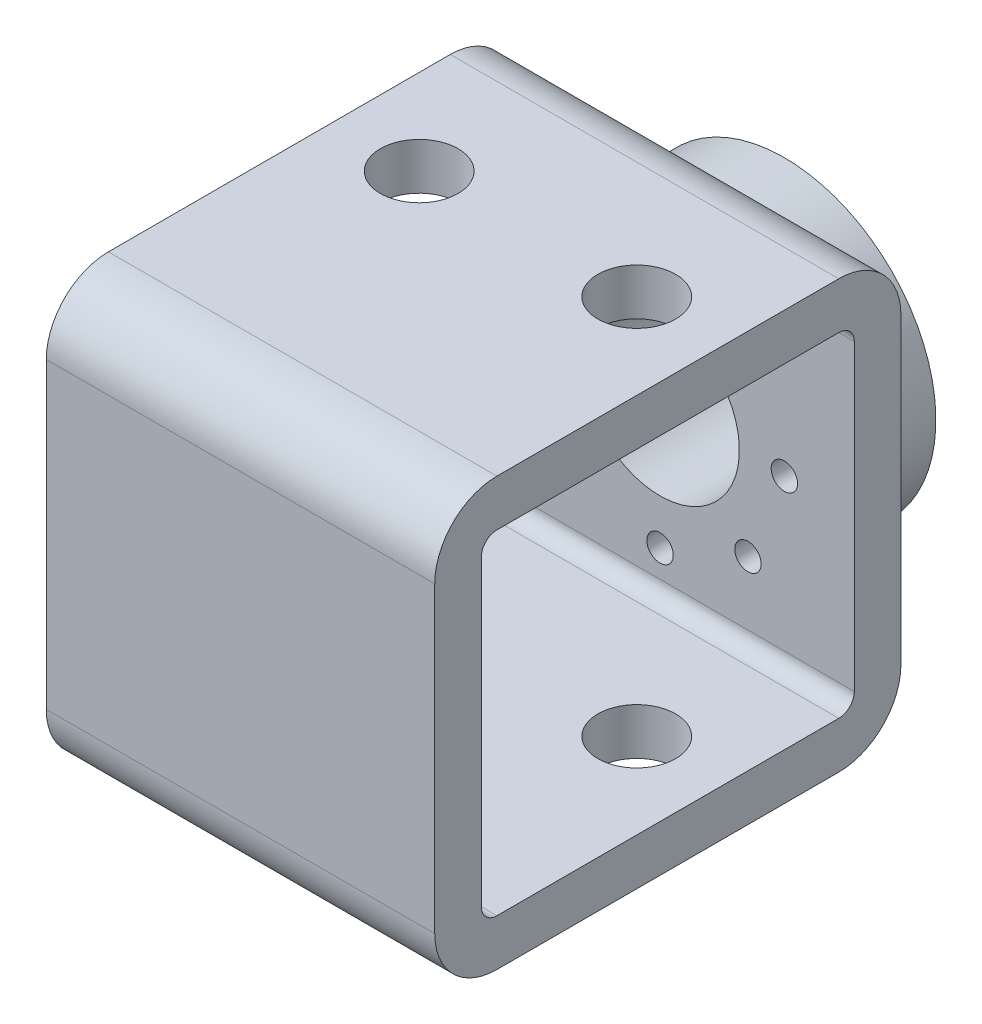
ISO-10303-21;
HEADER;
FILE_DESCRIPTION(('STEP AP214'),'2;1');
FILE_NAME('part.step','',(''),(''),'','','');
FILE_SCHEMA(('AUTOMOTIVE_DESIGN { 1 0 10303 214 1 1 1 1 }'));
ENDSEC;
DATA;
#1=APPLICATION_CONTEXT('core data for automotive mechanical design processes');
#2=APPLICATION_PROTOCOL_DEFINITION('international standard','automotive_design',2000,#1);
#3=PRODUCT_CONTEXT('',#1,'mechanical');
#4=PRODUCT('Part','Part','',(#3));
#5=PRODUCT_RELATED_PRODUCT_CATEGORY('part','',(#4));
#6=PRODUCT_DEFINITION_FORMATION('','',#4);
#7=PRODUCT_DEFINITION_CONTEXT('part definition',#1,'design');
#8=PRODUCT_DEFINITION('design','',#6,#7);
#9=PRODUCT_DEFINITION_SHAPE('','',#8);
#10=(LENGTH_UNIT() NAMED_UNIT(*) SI_UNIT(.MILLI.,.METRE.));
#11=(NAMED_UNIT(*) PLANE_ANGLE_UNIT() SI_UNIT($,.RADIAN.));
#12=(NAMED_UNIT(*) SI_UNIT($,.STERADIAN.) SOLID_ANGLE_UNIT());
#13=UNCERTAINTY_MEASURE_WITH_UNIT(LENGTH_MEASURE(1.E-05),#10,'distance_accuracy_value','');
#14=(GEOMETRIC_REPRESENTATION_CONTEXT(3) GLOBAL_UNCERTAINTY_ASSIGNED_CONTEXT((#13)) GLOBAL_UNIT_ASSIGNED_CONTEXT((#10,
#11,#12)) REPRESENTATION_CONTEXT('',''));
#15=CARTESIAN_POINT('',(0.,0.,0.));
#16=DIRECTION('',(0.,0.,1.));
#17=DIRECTION('',(1.,0.,0.));
#18=AXIS2_PLACEMENT_3D('',#15,#16,#17);
#19=CARTESIAN_POINT('',(0.,0.,0.));
#20=DIRECTION('',(0.,0.,1.));
#21=DIRECTION('',(1.,0.,0.));
#22=AXIS2_PLACEMENT_3D('',#19,#20,#21);
#23=PLANE('',#22);
#24=CARTESIAN_POINT('',(-5.656854249492,5.656854249492,0.));
#25=DIRECTION('',(0.,0.,-1.));
#26=DIRECTION('',(-1.,0.,0.));
#27=AXIS2_PLACEMENT_3D('',#24,#25,#26);
#28=CIRCLE('',#27,0.85);
#29=CARTESIAN_POINT('',(-6.506854249492,5.656854249492,0.));
#30=VERTEX_POINT('',#29);
#31=EDGE_CURVE('E303',#30,#30,#28,.F.);
#32=ORIENTED_EDGE('',*,*,#31,.T.);
#33=EDGE_LOOP('',(#32));
#34=FACE_BOUND('',#33,.T.);
#35=CARTESIAN_POINT('',(-8.,0.,0.));
#36=DIRECTION('',(0.,0.,-1.));
#37=DIRECTION('',(-1.,0.,0.));
#38=AXIS2_PLACEMENT_3D('',#35,#36,#37);
#39=CIRCLE('',#38,0.85);
#40=CARTESIAN_POINT('',(-8.85,0.,0.));
#41=VERTEX_POINT('',#40);
#42=EDGE_CURVE('E324',#41,#41,#39,.F.);
#43=ORIENTED_EDGE('',*,*,#42,.T.);
#44=EDGE_LOOP('',(#43));
#45=FACE_BOUND('',#44,.T.);
#46=CARTESIAN_POINT('',(-5.656854249492,-5.656854249492,0.));
#47=DIRECTION('',(0.,0.,-1.));
#48=DIRECTION('',(-1.,0.,0.));
#49=AXIS2_PLACEMENT_3D('',#46,#47,#48);
#50=CIRCLE('',#49,0.85);
#51=CARTESIAN_POINT('',(-6.506854249492,-5.656854249492,0.));
#52=VERTEX_POINT('',#51);
#53=EDGE_CURVE('E321',#52,#52,#50,.F.);
#54=ORIENTED_EDGE('',*,*,#53,.T.);
#55=EDGE_LOOP('',(#54));
#56=FACE_BOUND('',#55,.T.);
#57=CARTESIAN_POINT('',(0.,-8.,0.));
#58=DIRECTION('',(0.,0.,-1.));
#59=DIRECTION('',(-1.,0.,0.));
#60=AXIS2_PLACEMENT_3D('',#57,#58,#59);
#61=CIRCLE('',#60,0.85);
#62=CARTESIAN_POINT('',(-0.85,-8.,0.));
#63=VERTEX_POINT('',#62);
#64=EDGE_CURVE('E318',#63,#63,#61,.F.);
#65=ORIENTED_EDGE('',*,*,#64,.T.);
#66=EDGE_LOOP('',(#65));
#67=FACE_BOUND('',#66,.T.);
#68=CARTESIAN_POINT('',(5.656854249492,-5.656854249492,0.));
#69=DIRECTION('',(0.,0.,-1.));
#70=DIRECTION('',(-1.,0.,0.));
#71=AXIS2_PLACEMENT_3D('',#68,#69,#70);
#72=CIRCLE('',#71,0.85);
#73=CARTESIAN_POINT('',(4.806854249492,-5.656854249492,0.));
#74=VERTEX_POINT('',#73);
#75=EDGE_CURVE('E315',#74,#74,#72,.F.);
#76=ORIENTED_EDGE('',*,*,#75,.T.);
#77=EDGE_LOOP('',(#76));
#78=FACE_BOUND('',#77,.T.);
#79=CARTESIAN_POINT('',(8.,0.,0.));
#80=DIRECTION('',(0.,0.,-1.));
#81=DIRECTION('',(-1.,0.,0.));
#82=AXIS2_PLACEMENT_3D('',#79,#80,#81);
#83=CIRCLE('',#82,0.85);
#84=CARTESIAN_POINT('',(7.15,0.,0.));
#85=VERTEX_POINT('',#84);
#86=EDGE_CURVE('E312',#85,#85,#83,.F.);
#87=ORIENTED_EDGE('',*,*,#86,.T.);
#88=EDGE_LOOP('',(#87));
#89=FACE_BOUND('',#88,.T.);
#90=CARTESIAN_POINT('',(5.656854249492,5.656854249492,0.));
#91=DIRECTION('',(0.,0.,-1.));
#92=DIRECTION('',(-1.,0.,0.));
#93=AXIS2_PLACEMENT_3D('',#90,#91,#92);
#94=CIRCLE('',#93,0.850000000000001);
#95=CARTESIAN_POINT('',(4.806854249492,5.656854249492,0.));
#96=VERTEX_POINT('',#95);
#97=EDGE_CURVE('E309',#96,#96,#94,.F.);
#98=ORIENTED_EDGE('',*,*,#97,.T.);
#99=EDGE_LOOP('',(#98));
#100=FACE_BOUND('',#99,.T.);
#101=CARTESIAN_POINT('',(0.,8.,0.));
#102=DIRECTION('',(0.,0.,-1.));
#103=DIRECTION('',(-1.,0.,0.));
#104=AXIS2_PLACEMENT_3D('',#101,#102,#103);
#105=CIRCLE('',#104,0.85);
#106=CARTESIAN_POINT('',(-0.85,8.,0.));
#107=VERTEX_POINT('',#106);
#108=EDGE_CURVE('E306',#107,#107,#105,.F.);
#109=ORIENTED_EDGE('',*,*,#108,.T.);
#110=EDGE_LOOP('',(#109));
#111=FACE_BOUND('',#110,.T.);
#112=CARTESIAN_POINT('',(0.,0.,0.));
#113=DIRECTION('',(0.,0.,-1.));
#114=DIRECTION('',(-1.,0.,0.));
#115=AXIS2_PLACEMENT_3D('',#112,#113,#114);
#116=CIRCLE('',#115,5.10415336334852);
#117=CARTESIAN_POINT('',(-5.10415336334852,0.,0.));
#118=VERTEX_POINT('',#117);
#119=EDGE_CURVE('E300',#118,#118,#116,.F.);
#120=ORIENTED_EDGE('',*,*,#119,.T.);
#121=EDGE_LOOP('',(#120));
#122=FACE_BOUND('',#121,.T.);
#123=CARTESIAN_POINT('',(0.,0.,0.));
#124=DIRECTION('',(0.,0.,-1.));
#125=DIRECTION('',(-1.,0.,0.));
#126=AXIS2_PLACEMENT_3D('',#123,#124,#125);
#127=CIRCLE('',#126,9.75);
#128=CARTESIAN_POINT('',(-9.75,0.,0.));
#129=VERTEX_POINT('',#128);
#130=EDGE_CURVE('E20',#129,#129,#127,.F.);
#131=ORIENTED_EDGE('',*,*,#130,.F.);
#132=EDGE_LOOP('',(#131));
#133=FACE_BOUND('',#132,.T.);
#134=ADVANCED_FACE('F17',(#34,#45,#56,#67,#78,#89,#100,#111,#122,#133),#23,.F.);
#135=CARTESIAN_POINT('',(0.,0.,35.5771644662753));
#136=DIRECTION('',(0.,0.,-1.));
#137=DIRECTION('',(-1.,0.,0.));
#138=AXIS2_PLACEMENT_3D('',#135,#136,#137);
#139=CYLINDRICAL_SURFACE('',#138,9.75);
#140=ORIENTED_EDGE('',*,*,#130,.T.);
#141=EDGE_LOOP('',(#140));
#142=FACE_BOUND('',#141,.T.);
#143=CARTESIAN_POINT('',(0.,0.,4.99999999999991));
#144=DIRECTION('',(0.,0.,-1.));
#145=DIRECTION('',(-1.,0.,0.));
#146=AXIS2_PLACEMENT_3D('',#143,#144,#145);
#147=CIRCLE('',#146,9.75);
#148=CARTESIAN_POINT('',(0.,-9.75,4.99999999999995));
#149=VERTEX_POINT('',#148);
#150=CARTESIAN_POINT('',(0.,9.75,4.99999999999995));
#151=VERTEX_POINT('',#150);
#152=EDGE_CURVE('E213',#149,#151,#147,.T.);
#153=ORIENTED_EDGE('',*,*,#152,.T.);
#154=CARTESIAN_POINT('',(0.,0.,4.99999999999992));
#155=DIRECTION('',(0.,0.,-1.));
#156=DIRECTION('',(-1.,0.,0.));
#157=AXIS2_PLACEMENT_3D('',#154,#155,#156);
#158=CIRCLE('',#157,9.75);
#159=EDGE_CURVE('E289',#151,#149,#158,.T.);
#160=ORIENTED_EDGE('',*,*,#159,.T.);
#161=EDGE_LOOP('',(#153,#160));
#162=FACE_BOUND('',#161,.T.);
#163=ADVANCED_FACE('F494',(#142,#162),#139,.T.);
#164=CARTESIAN_POINT('',(7.,13.75,16.4999999999999));
#165=DIRECTION('',(0.,-1.,0.));
#166=DIRECTION('',(0.,0.,-1.));
#167=AXIS2_PLACEMENT_3D('',#164,#165,#166);
#168=CYLINDRICAL_SURFACE('',#167,2.49999999999997);
#169=CARTESIAN_POINT('',(7.,10.75,16.4999999999999));
#170=DIRECTION('',(0.,-1.,0.));
#171=DIRECTION('',(0.,0.,-1.));
#172=AXIS2_PLACEMENT_3D('',#169,#170,#171);
#173=CIRCLE('',#172,2.49999999999997);
#174=CARTESIAN_POINT('',(7.,10.75,13.9999999999999));
#175=VERTEX_POINT('',#174);
#176=EDGE_CURVE('E201',#175,#175,#173,.F.);
#177=ORIENTED_EDGE('',*,*,#176,.F.);
#178=EDGE_LOOP('',(#177));
#179=FACE_BOUND('',#178,.T.);
#180=CARTESIAN_POINT('',(7.,13.75,16.4999999999999));
#181=DIRECTION('',(0.,-1.,0.));
#182=DIRECTION('',(0.,0.,-1.));
#183=AXIS2_PLACEMENT_3D('',#180,#181,#182);
#184=CIRCLE('',#183,2.49999999999997);
#185=CARTESIAN_POINT('',(7.,13.75,13.9999999999999));
#186=VERTEX_POINT('',#185);
#187=EDGE_CURVE('E286',#186,#186,#184,.F.);
#188=ORIENTED_EDGE('',*,*,#187,.T.);
#189=EDGE_LOOP('',(#188));
#190=FACE_BOUND('',#189,.T.);
#191=ADVANCED_FACE('F513',(#179,#190),#168,.F.);
#192=CARTESIAN_POINT('',(-7.,13.75,16.4999999999999));
#193=DIRECTION('',(0.,-1.,0.));
#194=DIRECTION('',(0.,0.,-1.));
#195=AXIS2_PLACEMENT_3D('',#192,#193,#194);
#196=CYLINDRICAL_SURFACE('',#195,2.49999999999997);
#197=CARTESIAN_POINT('',(-7.,10.75,16.4999999999999));
#198=DIRECTION('',(0.,-1.,0.));
#199=DIRECTION('',(0.,0.,-1.));
#200=AXIS2_PLACEMENT_3D('',#197,#198,#199);
#201=CIRCLE('',#200,2.49999999999997);
#202=CARTESIAN_POINT('',(-7.,10.75,13.9999999999999));
#203=VERTEX_POINT('',#202);
#204=EDGE_CURVE('E197',#203,#203,#201,.F.);
#205=ORIENTED_EDGE('',*,*,#204,.F.);
#206=EDGE_LOOP('',(#205));
#207=FACE_BOUND('',#206,.T.);
#208=CARTESIAN_POINT('',(-7.,13.75,16.4999999999999));
#209=DIRECTION('',(0.,-1.,0.));
#210=DIRECTION('',(0.,0.,-1.));
#211=AXIS2_PLACEMENT_3D('',#208,#209,#210);
#212=CIRCLE('',#211,2.49999999999997);
#213=CARTESIAN_POINT('',(-7.,13.75,13.9999999999999));
#214=VERTEX_POINT('',#213);
#215=EDGE_CURVE('E220',#214,#214,#212,.F.);
#216=ORIENTED_EDGE('',*,*,#215,.T.);
#217=EDGE_LOOP('',(#216));
#218=FACE_BOUND('',#217,.T.);
#219=ADVANCED_FACE('F389',(#207,#218),#196,.F.);
#220=CARTESIAN_POINT('',(12.5,9.75,31.));
#221=DIRECTION('',(-1.,0.,0.));
#222=DIRECTION('',(0.,0.,1.));
#223=AXIS2_PLACEMENT_3D('',#220,#221,#222);
#224=CYLINDRICAL_SURFACE('',#223,0.999999999999994);
#225=DIRECTION('',(1.,0.,0.));
#226=VECTOR('',#225,1.);
#227=CARTESIAN_POINT('',(12.5,10.75,31.));
#228=LINE('',#227,#226);
#229=CARTESIAN_POINT('',(12.5,10.75,31.));
#230=VERTEX_POINT('',#229);
#231=CARTESIAN_POINT('',(-12.5,10.75,31.));
#232=VERTEX_POINT('',#231);
#233=EDGE_CURVE('E136',#230,#232,#228,.F.);
#234=ORIENTED_EDGE('',*,*,#233,.F.);
#235=CARTESIAN_POINT('',(12.5,9.75,31.));
#236=DIRECTION('',(-1.,0.,0.));
#237=DIRECTION('',(0.,0.,1.));
#238=AXIS2_PLACEMENT_3D('',#235,#236,#237);
#239=CIRCLE('',#238,0.999999999999994);
#240=CARTESIAN_POINT('',(12.5,9.75,32.));
#241=VERTEX_POINT('',#240);
#242=EDGE_CURVE('E130',#241,#230,#239,.T.);
#243=ORIENTED_EDGE('',*,*,#242,.F.);
#244=DIRECTION('',(-1.,0.,0.));
#245=VECTOR('',#244,1.);
#246=CARTESIAN_POINT('',(12.5,9.75,32.));
#247=LINE('',#246,#245);
#248=CARTESIAN_POINT('',(-12.5,9.75,32.));
#249=VERTEX_POINT('',#248);
#250=EDGE_CURVE('E133',#249,#241,#247,.F.);
#251=ORIENTED_EDGE('',*,*,#250,.F.);
#252=CARTESIAN_POINT('',(-12.5,9.75,31.));
#253=DIRECTION('',(-1.,0.,0.));
#254=DIRECTION('',(0.,0.,1.));
#255=AXIS2_PLACEMENT_3D('',#252,#253,#254);
#256=CIRCLE('',#255,0.999999999999994);
#257=EDGE_CURVE('E141',#232,#249,#256,.F.);
#258=ORIENTED_EDGE('',*,*,#257,.F.);
#259=EDGE_LOOP('',(#234,#243,#251,#258));
#260=FACE_BOUND('',#259,.T.);
#261=ADVANCED_FACE('F132',(#260),#224,.F.);
#262=CARTESIAN_POINT('',(12.5,-9.75000000000002,31.));
#263=DIRECTION('',(-1.,0.,0.));
#264=DIRECTION('',(0.,0.,1.));
#265=AXIS2_PLACEMENT_3D('',#262,#263,#264);
#266=CYLINDRICAL_SURFACE('',#265,1.);
#267=DIRECTION('',(-1.,0.,0.));
#268=VECTOR('',#267,1.);
#269=CARTESIAN_POINT('',(12.5,-9.75000000000002,32.));
#270=LINE('',#269,#268);
#271=CARTESIAN_POINT('',(12.5,-9.75000000000002,32.));
#272=VERTEX_POINT('',#271);
#273=CARTESIAN_POINT('',(-12.5,-9.75000000000002,32.));
#274=VERTEX_POINT('',#273);
#275=EDGE_CURVE('E149',#272,#274,#270,.T.);
#276=ORIENTED_EDGE('',*,*,#275,.F.);
#277=CARTESIAN_POINT('',(12.5,-9.75000000000002,31.));
#278=DIRECTION('',(-1.,0.,0.));
#279=DIRECTION('',(0.,0.,1.));
#280=AXIS2_PLACEMENT_3D('',#277,#278,#279);
#281=CIRCLE('',#280,1.);
#282=CARTESIAN_POINT('',(12.5,-10.75,31.));
#283=VERTEX_POINT('',#282);
#284=EDGE_CURVE('E154',#283,#272,#281,.T.);
#285=ORIENTED_EDGE('',*,*,#284,.F.);
#286=DIRECTION('',(1.,0.,0.));
#287=VECTOR('',#286,1.);
#288=CARTESIAN_POINT('',(12.5,-10.75,31.));
#289=LINE('',#288,#287);
#290=CARTESIAN_POINT('',(-12.5,-10.75,31.));
#291=VERTEX_POINT('',#290);
#292=EDGE_CURVE('E186',#291,#283,#289,.T.);
#293=ORIENTED_EDGE('',*,*,#292,.F.);
#294=CARTESIAN_POINT('',(-12.5,-9.75000000000002,31.));
#295=DIRECTION('',(-1.,0.,0.));
#296=DIRECTION('',(0.,0.,1.));
#297=AXIS2_PLACEMENT_3D('',#294,#295,#296);
#298=CIRCLE('',#297,1.);
#299=EDGE_CURVE('E327',#274,#291,#298,.F.);
#300=ORIENTED_EDGE('',*,*,#299,.F.);
#301=EDGE_LOOP('',(#276,#285,#293,#300));
#302=FACE_BOUND('',#301,.T.);
#303=ADVANCED_FACE('F377',(#302),#266,.F.);
#304=CARTESIAN_POINT('',(-8.,0.,35.5771644662753));
#305=DIRECTION('',(0.,0.,-1.));
#306=DIRECTION('',(-1.,0.,0.));
#307=AXIS2_PLACEMENT_3D('',#304,#305,#306);
#308=CYLINDRICAL_SURFACE('',#307,0.85);
#309=CARTESIAN_POINT('',(-8.,0.,7.99999999999999));
#310=DIRECTION('',(0.,0.,-1.));
#311=DIRECTION('',(-1.,0.,0.));
#312=AXIS2_PLACEMENT_3D('',#309,#310,#311);
#313=CIRCLE('',#312,0.85);
#314=CARTESIAN_POINT('',(-8.85,0.,7.99999999999999));
#315=VERTEX_POINT('',#314);
#316=EDGE_CURVE('E191',#315,#315,#313,.T.);
#317=ORIENTED_EDGE('',*,*,#316,.F.);
#318=EDGE_LOOP('',(#317));
#319=FACE_BOUND('',#318,.T.);
#320=ORIENTED_EDGE('',*,*,#42,.F.);
#321=EDGE_LOOP('',(#320));
#322=FACE_BOUND('',#321,.T.);
#323=ADVANCED_FACE('F379',(#319,#322),#308,.F.);
#324=CARTESIAN_POINT('',(-5.656854249492,-5.656854249492,35.5771644662753));
#325=DIRECTION('',(0.,0.,-1.));
#326=DIRECTION('',(-1.,0.,0.));
#327=AXIS2_PLACEMENT_3D('',#324,#325,#326);
#328=CYLINDRICAL_SURFACE('',#327,0.85);
#329=CARTESIAN_POINT('',(-5.656854249492,-5.656854249492,7.99999999999998));
#330=DIRECTION('',(0.,0.,-1.));
#331=DIRECTION('',(-1.,0.,0.));
#332=AXIS2_PLACEMENT_3D('',#329,#330,#331);
#333=CIRCLE('',#332,0.85);
#334=CARTESIAN_POINT('',(-6.506854249492,-5.656854249492,7.99999999999998));
#335=VERTEX_POINT('',#334);
#336=EDGE_CURVE('E273',#335,#335,#333,.T.);
#337=ORIENTED_EDGE('',*,*,#336,.F.);
#338=EDGE_LOOP('',(#337));
#339=FACE_BOUND('',#338,.T.);
#340=ORIENTED_EDGE('',*,*,#53,.F.);
#341=EDGE_LOOP('',(#340));
#342=FACE_BOUND('',#341,.T.);
#343=ADVANCED_FACE('F386',(#339,#342),#328,.F.);
#344=CARTESIAN_POINT('',(0.,-8.,35.5771644662753));
#345=DIRECTION('',(0.,0.,-1.));
#346=DIRECTION('',(-1.,0.,0.));
#347=AXIS2_PLACEMENT_3D('',#344,#345,#346);
#348=CYLINDRICAL_SURFACE('',#347,0.85);
#349=CARTESIAN_POINT('',(0.,-8.,7.99999999999998));
#350=DIRECTION('',(0.,0.,-1.));
#351=DIRECTION('',(-1.,0.,0.));
#352=AXIS2_PLACEMENT_3D('',#349,#350,#351);
#353=CIRCLE('',#352,0.85);
#354=CARTESIAN_POINT('',(-0.85,-8.,7.99999999999998));
#355=VERTEX_POINT('',#354);
#356=EDGE_CURVE('E270',#355,#355,#353,.T.);
#357=ORIENTED_EDGE('',*,*,#356,.F.);
#358=EDGE_LOOP('',(#357));
#359=FACE_BOUND('',#358,.T.);
#360=ORIENTED_EDGE('',*,*,#64,.F.);
#361=EDGE_LOOP('',(#360));
#362=FACE_BOUND('',#361,.T.);
#363=ADVANCED_FACE('F479',(#359,#362),#348,.F.);
#364=CARTESIAN_POINT('',(5.656854249492,-5.656854249492,35.5771644662753));
#365=DIRECTION('',(0.,0.,-1.));
#366=DIRECTION('',(-1.,0.,0.));
#367=AXIS2_PLACEMENT_3D('',#364,#365,#366);
#368=CYLINDRICAL_SURFACE('',#367,0.85);
#369=CARTESIAN_POINT('',(5.656854249492,-5.656854249492,7.99999999999998));
#370=DIRECTION('',(0.,0.,-1.));
#371=DIRECTION('',(-1.,0.,0.));
#372=AXIS2_PLACEMENT_3D('',#369,#370,#371);
#373=CIRCLE('',#372,0.85);
#374=CARTESIAN_POINT('',(4.806854249492,-5.656854249492,7.99999999999998));
#375=VERTEX_POINT('',#374);
#376=EDGE_CURVE('E267',#375,#375,#373,.T.);
#377=ORIENTED_EDGE('',*,*,#376,.F.);
#378=EDGE_LOOP('',(#377));
#379=FACE_BOUND('',#378,.T.);
#380=ORIENTED_EDGE('',*,*,#75,.F.);
#381=EDGE_LOOP('',(#380));
#382=FACE_BOUND('',#381,.T.);
#383=ADVANCED_FACE('F475',(#379,#382),#368,.F.);
#384=CARTESIAN_POINT('',(8.,0.,35.5771644662753));
#385=DIRECTION('',(0.,0.,-1.));
#386=DIRECTION('',(-1.,0.,0.));
#387=AXIS2_PLACEMENT_3D('',#384,#385,#386);
#388=CYLINDRICAL_SURFACE('',#387,0.85);
#389=CARTESIAN_POINT('',(8.,0.,7.99999999999999));
#390=DIRECTION('',(0.,0.,-1.));
#391=DIRECTION('',(-1.,0.,0.));
#392=AXIS2_PLACEMENT_3D('',#389,#390,#391);
#393=CIRCLE('',#392,0.85);
#394=CARTESIAN_POINT('',(7.15,0.,7.99999999999999));
#395=VERTEX_POINT('',#394);
#396=EDGE_CURVE('E264',#395,#395,#393,.T.);
#397=ORIENTED_EDGE('',*,*,#396,.F.);
#398=EDGE_LOOP('',(#397));
#399=FACE_BOUND('',#398,.T.);
#400=ORIENTED_EDGE('',*,*,#86,.F.);
#401=EDGE_LOOP('',(#400));
#402=FACE_BOUND('',#401,.T.);
#403=ADVANCED_FACE('F471',(#399,#402),#388,.F.);
#404=CARTESIAN_POINT('',(5.656854249492,5.656854249492,35.5771644662753));
#405=DIRECTION('',(0.,0.,-1.));
#406=DIRECTION('',(-1.,0.,0.));
#407=AXIS2_PLACEMENT_3D('',#404,#405,#406);
#408=CYLINDRICAL_SURFACE('',#407,0.850000000000001);
#409=CARTESIAN_POINT('',(5.656854249492,5.656854249492,7.99999999999999));
#410=DIRECTION('',(0.,0.,-1.));
#411=DIRECTION('',(-1.,0.,0.));
#412=AXIS2_PLACEMENT_3D('',#409,#410,#411);
#413=CIRCLE('',#412,0.850000000000001);
#414=CARTESIAN_POINT('',(4.806854249492,5.656854249492,7.99999999999999));
#415=VERTEX_POINT('',#414);
#416=EDGE_CURVE('E261',#415,#415,#413,.T.);
#417=ORIENTED_EDGE('',*,*,#416,.F.);
#418=EDGE_LOOP('',(#417));
#419=FACE_BOUND('',#418,.T.);
#420=ORIENTED_EDGE('',*,*,#97,.F.);
#421=EDGE_LOOP('',(#420));
#422=FACE_BOUND('',#421,.T.);
#423=ADVANCED_FACE('F467',(#419,#422),#408,.F.);
#424=CARTESIAN_POINT('',(0.,8.,35.5771644662753));
#425=DIRECTION('',(0.,0.,-1.));
#426=DIRECTION('',(-1.,0.,0.));
#427=AXIS2_PLACEMENT_3D('',#424,#425,#426);
#428=CYLINDRICAL_SURFACE('',#427,0.85);
#429=CARTESIAN_POINT('',(0.,8.,7.99999999999999));
#430=DIRECTION('',(0.,0.,-1.));
#431=DIRECTION('',(-1.,0.,0.));
#432=AXIS2_PLACEMENT_3D('',#429,#430,#431);
#433=CIRCLE('',#432,0.85);
#434=CARTESIAN_POINT('',(-0.85,8.,7.99999999999999));
#435=VERTEX_POINT('',#434);
#436=EDGE_CURVE('E258',#435,#435,#433,.T.);
#437=ORIENTED_EDGE('',*,*,#436,.F.);
#438=EDGE_LOOP('',(#437));
#439=FACE_BOUND('',#438,.T.);
#440=ORIENTED_EDGE('',*,*,#108,.F.);
#441=EDGE_LOOP('',(#440));
#442=FACE_BOUND('',#441,.T.);
#443=ADVANCED_FACE('F463',(#439,#442),#428,.F.);
#444=CARTESIAN_POINT('',(-5.656854249492,5.656854249492,35.5771644662753));
#445=DIRECTION('',(0.,0.,-1.));
#446=DIRECTION('',(-1.,0.,0.));
#447=AXIS2_PLACEMENT_3D('',#444,#445,#446);
#448=CYLINDRICAL_SURFACE('',#447,0.85);
#449=CARTESIAN_POINT('',(-5.656854249492,5.656854249492,7.99999999999999));
#450=DIRECTION('',(0.,0.,-1.));
#451=DIRECTION('',(-1.,0.,0.));
#452=AXIS2_PLACEMENT_3D('',#449,#450,#451);
#453=CIRCLE('',#452,0.85);
#454=CARTESIAN_POINT('',(-6.506854249492,5.656854249492,7.99999999999999));
#455=VERTEX_POINT('',#454);
#456=EDGE_CURVE('E255',#455,#455,#453,.T.);
#457=ORIENTED_EDGE('',*,*,#456,.F.);
#458=EDGE_LOOP('',(#457));
#459=FACE_BOUND('',#458,.T.);
#460=ORIENTED_EDGE('',*,*,#31,.F.);
#461=EDGE_LOOP('',(#460));
#462=FACE_BOUND('',#461,.T.);
#463=ADVANCED_FACE('F459',(#459,#462),#448,.F.);
#464=CARTESIAN_POINT('',(0.,0.,35.5771644662753));
#465=DIRECTION('',(0.,0.,-1.));
#466=DIRECTION('',(-1.,0.,0.));
#467=AXIS2_PLACEMENT_3D('',#464,#465,#466);
#468=CYLINDRICAL_SURFACE('',#467,5.10415336334852);
#469=CARTESIAN_POINT('',(0.,0.,7.99999999999999));
#470=DIRECTION('',(0.,0.,-1.));
#471=DIRECTION('',(-1.,0.,0.));
#472=AXIS2_PLACEMENT_3D('',#469,#470,#471);
#473=CIRCLE('',#472,5.10415336334852);
#474=CARTESIAN_POINT('',(-5.10415336334852,0.,7.99999999999999));
#475=VERTEX_POINT('',#474);
#476=EDGE_CURVE('E182',#475,#475,#473,.T.);
#477=ORIENTED_EDGE('',*,*,#476,.F.);
#478=EDGE_LOOP('',(#477));
#479=FACE_BOUND('',#478,.T.);
#480=ORIENTED_EDGE('',*,*,#119,.F.);
#481=EDGE_LOOP('',(#480));
#482=FACE_BOUND('',#481,.T.);
#483=ADVANCED_FACE('F456',(#479,#482),#468,.F.);
#484=CARTESIAN_POINT('',(12.5,-9.75,8.99999999999998));
#485=DIRECTION('',(-1.,0.,0.));
#486=DIRECTION('',(0.,0.,1.));
#487=AXIS2_PLACEMENT_3D('',#484,#485,#486);
#488=CYLINDRICAL_SURFACE('',#487,0.999999999999999);
#489=DIRECTION('',(1.,0.,0.));
#490=VECTOR('',#489,1.);
#491=CARTESIAN_POINT('',(12.5,-10.75,8.99999999999998));
#492=LINE('',#491,#490);
#493=CARTESIAN_POINT('',(12.5,-10.75,8.99999999999998));
#494=VERTEX_POINT('',#493);
#495=CARTESIAN_POINT('',(-12.5,-10.75,8.99999999999998));
#496=VERTEX_POINT('',#495);
#497=EDGE_CURVE('E189',#494,#496,#492,.F.);
#498=ORIENTED_EDGE('',*,*,#497,.F.);
#499=CARTESIAN_POINT('',(12.5,-9.75,8.99999999999998));
#500=DIRECTION('',(-1.,0.,0.));
#501=DIRECTION('',(0.,0.,1.));
#502=AXIS2_PLACEMENT_3D('',#499,#500,#501);
#503=CIRCLE('',#502,0.999999999999999);
#504=CARTESIAN_POINT('',(12.5,-9.75,7.99999999999998));
#505=VERTEX_POINT('',#504);
#506=EDGE_CURVE('E298',#505,#494,#503,.T.);
#507=ORIENTED_EDGE('',*,*,#506,.F.);
#508=DIRECTION('',(1.,0.,0.));
#509=VECTOR('',#508,1.);
#510=CARTESIAN_POINT('',(12.5,-9.75,7.99999999999998));
#511=LINE('',#510,#509);
#512=CARTESIAN_POINT('',(-12.5,-9.75,7.99999999999998));
#513=VERTEX_POINT('',#512);
#514=EDGE_CURVE('E178',#513,#505,#511,.T.);
#515=ORIENTED_EDGE('',*,*,#514,.F.);
#516=CARTESIAN_POINT('',(-12.5,-9.75,8.99999999999998));
#517=DIRECTION('',(-1.,0.,0.));
#518=DIRECTION('',(0.,0.,1.));
#519=AXIS2_PLACEMENT_3D('',#516,#517,#518);
#520=CIRCLE('',#519,0.999999999999999);
#521=EDGE_CURVE('E296',#496,#513,#520,.F.);
#522=ORIENTED_EDGE('',*,*,#521,.F.);
#523=EDGE_LOOP('',(#498,#507,#515,#522));
#524=FACE_BOUND('',#523,.T.);
#525=ADVANCED_FACE('F370',(#524),#488,.F.);
#526=CARTESIAN_POINT('',(12.5,9.75,8.99999999999999));
#527=DIRECTION('',(-1.,0.,0.));
#528=DIRECTION('',(0.,0.,1.));
#529=AXIS2_PLACEMENT_3D('',#526,#527,#528);
#530=CYLINDRICAL_SURFACE('',#529,1.);
#531=DIRECTION('',(1.,0.,0.));
#532=VECTOR('',#531,1.);
#533=CARTESIAN_POINT('',(12.5,9.75,7.99999999999999));
#534=LINE('',#533,#532);
#535=CARTESIAN_POINT('',(12.5,9.75,7.99999999999998));
#536=VERTEX_POINT('',#535);
#537=CARTESIAN_POINT('',(-12.5,9.75,7.99999999999998));
#538=VERTEX_POINT('',#537);
#539=EDGE_CURVE('E181',#536,#538,#534,.F.);
#540=ORIENTED_EDGE('',*,*,#539,.F.);
#541=CARTESIAN_POINT('',(12.5,9.75,8.99999999999999));
#542=DIRECTION('',(-1.,0.,0.));
#543=DIRECTION('',(0.,0.,1.));
#544=AXIS2_PLACEMENT_3D('',#541,#542,#543);
#545=CIRCLE('',#544,1.);
#546=CARTESIAN_POINT('',(12.5,10.75,8.99999999999999));
#547=VERTEX_POINT('',#546);
#548=EDGE_CURVE('E294',#547,#536,#545,.T.);
#549=ORIENTED_EDGE('',*,*,#548,.F.);
#550=DIRECTION('',(1.,0.,0.));
#551=VECTOR('',#550,1.);
#552=CARTESIAN_POINT('',(12.5,10.75,8.99999999999999));
#553=LINE('',#552,#551);
#554=CARTESIAN_POINT('',(-12.5,10.75,8.99999999999999));
#555=VERTEX_POINT('',#554);
#556=EDGE_CURVE('E194',#555,#547,#553,.T.);
#557=ORIENTED_EDGE('',*,*,#556,.F.);
#558=CARTESIAN_POINT('',(-12.5,9.75,8.99999999999999));
#559=DIRECTION('',(-1.,0.,0.));
#560=DIRECTION('',(0.,0.,1.));
#561=AXIS2_PLACEMENT_3D('',#558,#559,#560);
#562=CIRCLE('',#561,1.);
#563=EDGE_CURVE('E292',#538,#555,#562,.F.);
#564=ORIENTED_EDGE('',*,*,#563,.F.);
#565=EDGE_LOOP('',(#540,#549,#557,#564));
#566=FACE_BOUND('',#565,.T.);
#567=ADVANCED_FACE('F367',(#566),#530,.F.);
#568=CARTESIAN_POINT('',(12.5,9.75,4.99999999999999));
#569=DIRECTION('',(0.,0.,1.));
#570=DIRECTION('',(0.,-1.,0.));
#571=AXIS2_PLACEMENT_3D('',#568,#569,#570);
#572=PLANE('',#571);
#573=ORIENTED_EDGE('',*,*,#159,.F.);
#574=DIRECTION('',(-1.,0.,0.));
#575=VECTOR('',#574,1.);
#576=CARTESIAN_POINT('',(12.5,9.75,4.99999999999999));
#577=LINE('',#576,#575);
#578=CARTESIAN_POINT('',(12.5,9.75,4.99999999999999));
#579=VERTEX_POINT('',#578);
#580=EDGE_CURVE('E216',#579,#151,#577,.T.);
#581=ORIENTED_EDGE('',*,*,#580,.F.);
#582=DIRECTION('',(0.,1.,0.));
#583=VECTOR('',#582,1.);
#584=CARTESIAN_POINT('',(12.5,9.75,4.99999999999999));
#585=LINE('',#584,#583);
#586=CARTESIAN_POINT('',(12.5,-9.75,4.99999999999998));
#587=VERTEX_POINT('',#586);
#588=EDGE_CURVE('E170',#579,#587,#585,.F.);
#589=ORIENTED_EDGE('',*,*,#588,.T.);
#590=DIRECTION('',(-1.,0.,0.));
#591=VECTOR('',#590,1.);
#592=CARTESIAN_POINT('',(12.5,-9.75,4.99999999999998));
#593=LINE('',#592,#591);
#594=EDGE_CURVE('E209',#149,#587,#593,.F.);
#595=ORIENTED_EDGE('',*,*,#594,.F.);
#596=EDGE_LOOP('',(#573,#581,#589,#595));
#597=FACE_BOUND('',#596,.T.);
#598=ADVANCED_FACE('F447',(#597),#572,.F.);
#599=CARTESIAN_POINT('',(12.5,9.75,31.));
#600=DIRECTION('',(-1.,0.,0.));
#601=DIRECTION('',(0.,0.,1.));
#602=AXIS2_PLACEMENT_3D('',#599,#600,#601);
#603=CYLINDRICAL_SURFACE('',#602,4.);
#604=CARTESIAN_POINT('',(12.5,9.75,31.));
#605=DIRECTION('',(-1.,0.,0.));
#606=DIRECTION('',(0.,0.,1.));
#607=AXIS2_PLACEMENT_3D('',#604,#605,#606);
#608=CIRCLE('',#607,4.);
#609=CARTESIAN_POINT('',(12.5,9.75,35.));
#610=VERTEX_POINT('',#609);
#611=CARTESIAN_POINT('',(12.5,13.75,31.));
#612=VERTEX_POINT('',#611);
#613=EDGE_CURVE('E157',#610,#612,#608,.T.);
#614=ORIENTED_EDGE('',*,*,#613,.T.);
#615=DIRECTION('',(1.,0.,0.));
#616=VECTOR('',#615,1.);
#617=CARTESIAN_POINT('',(12.5,13.75,31.));
#618=LINE('',#617,#616);
#619=CARTESIAN_POINT('',(-12.5,13.75,31.));
#620=VERTEX_POINT('',#619);
#621=EDGE_CURVE('E217',#612,#620,#618,.F.);
#622=ORIENTED_EDGE('',*,*,#621,.T.);
#623=CARTESIAN_POINT('',(-12.5,9.75,31.));
#624=DIRECTION('',(-1.,0.,0.));
#625=DIRECTION('',(0.,0.,1.));
#626=AXIS2_PLACEMENT_3D('',#623,#624,#625);
#627=CIRCLE('',#626,4.);
#628=CARTESIAN_POINT('',(-12.5,9.75,35.));
#629=VERTEX_POINT('',#628);
#630=EDGE_CURVE('E242',#629,#620,#627,.T.);
#631=ORIENTED_EDGE('',*,*,#630,.F.);
#632=DIRECTION('',(1.,0.,0.));
#633=VECTOR('',#632,1.);
#634=CARTESIAN_POINT('',(12.5,9.75,35.));
#635=LINE('',#634,#633);
#636=EDGE_CURVE('E199',#629,#610,#635,.T.);
#637=ORIENTED_EDGE('',*,*,#636,.T.);
#638=EDGE_LOOP('',(#614,#622,#631,#637));
#639=FACE_BOUND('',#638,.T.);
#640=ADVANCED_FACE('F443',(#639),#603,.T.);
#641=CARTESIAN_POINT('',(12.5,13.75,31.));
#642=DIRECTION('',(0.,-1.,0.));
#643=DIRECTION('',(0.,0.,-1.));
#644=AXIS2_PLACEMENT_3D('',#641,#642,#643);
#645=PLANE('',#644);
#646=ORIENTED_EDGE('',*,*,#621,.F.);
#647=DIRECTION('',(0.,0.,1.));
#648=VECTOR('',#647,1.);
#649=CARTESIAN_POINT('',(12.5,13.75,31.));
#650=LINE('',#649,#648);
#651=CARTESIAN_POINT('',(12.5,13.75,8.99999999999999));
#652=VERTEX_POINT('',#651);
#653=EDGE_CURVE('E174',#612,#652,#650,.F.);
#654=ORIENTED_EDGE('',*,*,#653,.T.);
#655=DIRECTION('',(-1.,0.,0.));
#656=VECTOR('',#655,1.);
#657=CARTESIAN_POINT('',(12.5,13.75,8.99999999999999));
#658=LINE('',#657,#656);
#659=CARTESIAN_POINT('',(-12.5,13.75,8.99999999999999));
#660=VERTEX_POINT('',#659);
#661=EDGE_CURVE('E214',#660,#652,#658,.F.);
#662=ORIENTED_EDGE('',*,*,#661,.F.);
#663=DIRECTION('',(0.,0.,1.));
#664=VECTOR('',#663,1.);
#665=CARTESIAN_POINT('',(-12.5,13.75,31.));
#666=LINE('',#665,#664);
#667=EDGE_CURVE('E241',#620,#660,#666,.F.);
#668=ORIENTED_EDGE('',*,*,#667,.F.);
#669=EDGE_LOOP('',(#646,#654,#662,#668));
#670=FACE_BOUND('',#669,.T.);
#671=ORIENTED_EDGE('',*,*,#215,.F.);
#672=EDGE_LOOP('',(#671));
#673=FACE_BOUND('',#672,.T.);
#674=ORIENTED_EDGE('',*,*,#187,.F.);
#675=EDGE_LOOP('',(#674));
#676=FACE_BOUND('',#675,.T.);
#677=ADVANCED_FACE('F439',(#670,#673,#676),#645,.F.);
#678=CARTESIAN_POINT('',(12.5,9.75,8.99999999999999));
#679=DIRECTION('',(-1.,0.,0.));
#680=DIRECTION('',(0.,0.,1.));
#681=AXIS2_PLACEMENT_3D('',#678,#679,#680);
#682=CYLINDRICAL_SURFACE('',#681,4.);
#683=ORIENTED_EDGE('',*,*,#580,.T.);
#684=DIRECTION('',(1.,0.,0.));
#685=VECTOR('',#684,1.);
#686=CARTESIAN_POINT('',(12.5,9.75,4.99999999999999));
#687=LINE('',#686,#685);
#688=CARTESIAN_POINT('',(-12.5,9.75,4.99999999999999));
#689=VERTEX_POINT('',#688);
#690=EDGE_CURVE('E202',#151,#689,#687,.F.);
#691=ORIENTED_EDGE('',*,*,#690,.T.);
#692=CARTESIAN_POINT('',(-12.5,9.75,8.99999999999999));
#693=DIRECTION('',(-1.,0.,0.));
#694=DIRECTION('',(0.,0.,1.));
#695=AXIS2_PLACEMENT_3D('',#692,#693,#694);
#696=CIRCLE('',#695,4.);
#697=EDGE_CURVE('E239',#660,#689,#696,.T.);
#698=ORIENTED_EDGE('',*,*,#697,.F.);
#699=ORIENTED_EDGE('',*,*,#661,.T.);
#700=CARTESIAN_POINT('',(12.5,9.75,8.99999999999999));
#701=DIRECTION('',(-1.,0.,0.));
#702=DIRECTION('',(0.,0.,1.));
#703=AXIS2_PLACEMENT_3D('',#700,#701,#702);
#704=CIRCLE('',#703,4.);
#705=EDGE_CURVE('E173',#652,#579,#704,.T.);
#706=ORIENTED_EDGE('',*,*,#705,.T.);
#707=EDGE_LOOP('',(#683,#691,#698,#699,#706));
#708=FACE_BOUND('',#707,.T.);
#709=ADVANCED_FACE('F435',(#708),#682,.T.);
#710=CARTESIAN_POINT('',(12.5,9.75,4.99999999999999));
#711=DIRECTION('',(0.,0.,1.));
#712=DIRECTION('',(0.,-1.,0.));
#713=AXIS2_PLACEMENT_3D('',#710,#711,#712);
#714=PLANE('',#713);
#715=ORIENTED_EDGE('',*,*,#152,.F.);
#716=DIRECTION('',(-1.,0.,0.));
#717=VECTOR('',#716,1.);
#718=CARTESIAN_POINT('',(12.5,-9.75,4.99999999999998));
#719=LINE('',#718,#717);
#720=CARTESIAN_POINT('',(-12.5,-9.75,4.99999999999998));
#721=VERTEX_POINT('',#720);
#722=EDGE_CURVE('E206',#721,#149,#719,.F.);
#723=ORIENTED_EDGE('',*,*,#722,.F.);
#724=DIRECTION('',(0.,1.,0.));
#725=VECTOR('',#724,1.);
#726=CARTESIAN_POINT('',(-12.5,9.75,4.99999999999999));
#727=LINE('',#726,#725);
#728=EDGE_CURVE('E238',#689,#721,#727,.F.);
#729=ORIENTED_EDGE('',*,*,#728,.F.);
#730=ORIENTED_EDGE('',*,*,#690,.F.);
#731=EDGE_LOOP('',(#715,#723,#729,#730));
#732=FACE_BOUND('',#731,.T.);
#733=ADVANCED_FACE('F431',(#732),#714,.F.);
#734=CARTESIAN_POINT('',(12.5,-9.75000000000002,35.));
#735=DIRECTION('',(0.,0.,-1.));
#736=DIRECTION('',(0.,1.,0.));
#737=AXIS2_PLACEMENT_3D('',#734,#735,#736);
#738=PLANE('',#737);
#739=DIRECTION('',(-1.,0.,0.));
#740=VECTOR('',#739,1.);
#741=CARTESIAN_POINT('',(12.5,-9.75000000000002,35.));
#742=LINE('',#741,#740);
#743=CARTESIAN_POINT('',(12.5,-9.75000000000002,35.));
#744=VERTEX_POINT('',#743);
#745=CARTESIAN_POINT('',(-12.5,-9.75000000000002,35.));
#746=VERTEX_POINT('',#745);
#747=EDGE_CURVE('E177',#744,#746,#742,.T.);
#748=ORIENTED_EDGE('',*,*,#747,.F.);
#749=DIRECTION('',(0.,1.,0.));
#750=VECTOR('',#749,1.);
#751=CARTESIAN_POINT('',(12.5,9.75,35.));
#752=LINE('',#751,#750);
#753=EDGE_CURVE('E163',#744,#610,#752,.T.);
#754=ORIENTED_EDGE('',*,*,#753,.T.);
#755=ORIENTED_EDGE('',*,*,#636,.F.);
#756=DIRECTION('',(0.,1.,0.));
#757=VECTOR('',#756,1.);
#758=CARTESIAN_POINT('',(-12.5,9.75,35.));
#759=LINE('',#758,#757);
#760=EDGE_CURVE('E236',#746,#629,#759,.T.);
#761=ORIENTED_EDGE('',*,*,#760,.F.);
#762=EDGE_LOOP('',(#748,#754,#755,#761));
#763=FACE_BOUND('',#762,.T.);
#764=ADVANCED_FACE('F428',(#763),#738,.F.);
#765=CARTESIAN_POINT('',(12.5,10.75,31.));
#766=DIRECTION('',(0.,-1.,0.));
#767=DIRECTION('',(0.,0.,-1.));
#768=AXIS2_PLACEMENT_3D('',#765,#766,#767);
#769=PLANE('',#768);
#770=DIRECTION('',(0.,0.,1.));
#771=VECTOR('',#770,1.);
#772=CARTESIAN_POINT('',(12.5,10.75,31.));
#773=LINE('',#772,#771);
#774=EDGE_CURVE('E210',#547,#230,#773,.T.);
#775=ORIENTED_EDGE('',*,*,#774,.T.);
#776=ORIENTED_EDGE('',*,*,#233,.T.);
#777=DIRECTION('',(0.,0.,1.));
#778=VECTOR('',#777,1.);
#779=CARTESIAN_POINT('',(-12.5,10.75,31.));
#780=LINE('',#779,#778);
#781=EDGE_CURVE('E335',#555,#232,#780,.T.);
#782=ORIENTED_EDGE('',*,*,#781,.F.);
#783=ORIENTED_EDGE('',*,*,#556,.T.);
#784=EDGE_LOOP('',(#775,#776,#782,#783));
#785=FACE_BOUND('',#784,.T.);
#786=ORIENTED_EDGE('',*,*,#204,.T.);
#787=EDGE_LOOP('',(#786));
#788=FACE_BOUND('',#787,.T.);
#789=ORIENTED_EDGE('',*,*,#176,.T.);
#790=EDGE_LOOP('',(#789));
#791=FACE_BOUND('',#790,.T.);
#792=ADVANCED_FACE('F337',(#785,#788,#791),#769,.T.);
#793=CARTESIAN_POINT('',(12.5,-9.75000000000002,32.));
#794=DIRECTION('',(0.,0.,-1.));
#795=DIRECTION('',(-1.,0.,0.));
#796=AXIS2_PLACEMENT_3D('',#793,#794,#795);
#797=PLANE('',#796);
#798=DIRECTION('',(0.,1.,0.));
#799=VECTOR('',#798,1.);
#800=CARTESIAN_POINT('',(12.5,9.75,32.));
#801=LINE('',#800,#799);
#802=EDGE_CURVE('E146',#241,#272,#801,.F.);
#803=ORIENTED_EDGE('',*,*,#802,.T.);
#804=ORIENTED_EDGE('',*,*,#275,.T.);
#805=DIRECTION('',(0.,1.,0.));
#806=VECTOR('',#805,1.);
#807=CARTESIAN_POINT('',(-12.5,9.75,32.));
#808=LINE('',#807,#806);
#809=EDGE_CURVE('E148',#249,#274,#808,.F.);
#810=ORIENTED_EDGE('',*,*,#809,.F.);
#811=ORIENTED_EDGE('',*,*,#250,.T.);
#812=EDGE_LOOP('',(#803,#804,#810,#811));
#813=FACE_BOUND('',#812,.T.);
#814=ADVANCED_FACE('F144',(#813),#797,.T.);
#815=CARTESIAN_POINT('',(12.5,-10.75,8.99999999999998));
#816=DIRECTION('',(0.,1.,0.));
#817=DIRECTION('',(0.,0.,1.));
#818=AXIS2_PLACEMENT_3D('',#815,#816,#817);
#819=PLANE('',#818);
#820=DIRECTION('',(0.,0.,1.));
#821=VECTOR('',#820,1.);
#822=CARTESIAN_POINT('',(12.5,-10.75,31.));
#823=LINE('',#822,#821);
#824=EDGE_CURVE('E156',#283,#494,#823,.F.);
#825=ORIENTED_EDGE('',*,*,#824,.T.);
#826=ORIENTED_EDGE('',*,*,#497,.T.);
#827=DIRECTION('',(0.,0.,1.));
#828=VECTOR('',#827,1.);
#829=CARTESIAN_POINT('',(-12.5,-10.75,31.));
#830=LINE('',#829,#828);
#831=EDGE_CURVE('E356',#291,#496,#830,.F.);
#832=ORIENTED_EDGE('',*,*,#831,.F.);
#833=ORIENTED_EDGE('',*,*,#292,.T.);
#834=EDGE_LOOP('',(#825,#826,#832,#833));
#835=FACE_BOUND('',#834,.T.);
#836=CARTESIAN_POINT('',(-7.,-10.75,16.4999999999999));
#837=DIRECTION('',(0.,-1.,0.));
#838=DIRECTION('',(0.,0.,-1.));
#839=AXIS2_PLACEMENT_3D('',#836,#837,#838);
#840=CIRCLE('',#839,2.49999999999997);
#841=CARTESIAN_POINT('',(-7.,-10.75,13.9999999999999));
#842=VERTEX_POINT('',#841);
#843=EDGE_CURVE('E205',#842,#842,#840,.T.);
#844=ORIENTED_EDGE('',*,*,#843,.T.);
#845=EDGE_LOOP('',(#844));
#846=FACE_BOUND('',#845,.T.);
#847=CARTESIAN_POINT('',(7.,-10.75,16.4999999999999));
#848=DIRECTION('',(0.,-1.,0.));
#849=DIRECTION('',(0.,0.,-1.));
#850=AXIS2_PLACEMENT_3D('',#847,#848,#849);
#851=CIRCLE('',#850,2.49999999999997);
#852=CARTESIAN_POINT('',(7.,-10.75,13.9999999999999));
#853=VERTEX_POINT('',#852);
#854=EDGE_CURVE('E185',#853,#853,#851,.T.);
#855=ORIENTED_EDGE('',*,*,#854,.T.);
#856=EDGE_LOOP('',(#855));
#857=FACE_BOUND('',#856,.T.);
#858=ADVANCED_FACE('F373',(#835,#846,#857),#819,.T.);
#859=CARTESIAN_POINT('',(12.5,9.75,7.99999999999999));
#860=DIRECTION('',(0.,0.,1.));
#861=DIRECTION('',(0.,-1.,0.));
#862=AXIS2_PLACEMENT_3D('',#859,#860,#861);
#863=PLANE('',#862);
#864=DIRECTION('',(0.,1.,0.));
#865=VECTOR('',#864,1.);
#866=CARTESIAN_POINT('',(12.5,9.75,7.99999999999998));
#867=LINE('',#866,#865);
#868=EDGE_CURVE('E160',#505,#536,#867,.T.);
#869=ORIENTED_EDGE('',*,*,#868,.T.);
#870=ORIENTED_EDGE('',*,*,#539,.T.);
#871=DIRECTION('',(0.,1.,0.));
#872=VECTOR('',#871,1.);
#873=CARTESIAN_POINT('',(-12.5,9.75,7.99999999999998));
#874=LINE('',#873,#872);
#875=EDGE_CURVE('E232',#513,#538,#874,.T.);
#876=ORIENTED_EDGE('',*,*,#875,.F.);
#877=ORIENTED_EDGE('',*,*,#514,.T.);
#878=EDGE_LOOP('',(#869,#870,#876,#877));
#879=FACE_BOUND('',#878,.T.);
#880=ORIENTED_EDGE('',*,*,#476,.T.);
#881=EDGE_LOOP('',(#880));
#882=FACE_BOUND('',#881,.T.);
#883=ORIENTED_EDGE('',*,*,#456,.T.);
#884=EDGE_LOOP('',(#883));
#885=FACE_BOUND('',#884,.T.);
#886=ORIENTED_EDGE('',*,*,#436,.T.);
#887=EDGE_LOOP('',(#886));
#888=FACE_BOUND('',#887,.T.);
#889=ORIENTED_EDGE('',*,*,#416,.T.);
#890=EDGE_LOOP('',(#889));
#891=FACE_BOUND('',#890,.T.);
#892=ORIENTED_EDGE('',*,*,#396,.T.);
#893=EDGE_LOOP('',(#892));
#894=FACE_BOUND('',#893,.T.);
#895=ORIENTED_EDGE('',*,*,#376,.T.);
#896=EDGE_LOOP('',(#895));
#897=FACE_BOUND('',#896,.T.);
#898=ORIENTED_EDGE('',*,*,#356,.T.);
#899=EDGE_LOOP('',(#898));
#900=FACE_BOUND('',#899,.T.);
#901=ORIENTED_EDGE('',*,*,#336,.T.);
#902=EDGE_LOOP('',(#901));
#903=FACE_BOUND('',#902,.T.);
#904=ORIENTED_EDGE('',*,*,#316,.T.);
#905=EDGE_LOOP('',(#904));
#906=FACE_BOUND('',#905,.T.);
#907=ADVANCED_FACE('F362',(#879,#882,#885,#888,#891,#894,#897,#900,#903,#906),#863,.T.);
#908=CARTESIAN_POINT('',(7.,13.75,16.4999999999999));
#909=DIRECTION('',(0.,-1.,0.));
#910=DIRECTION('',(0.,0.,-1.));
#911=AXIS2_PLACEMENT_3D('',#908,#909,#910);
#912=CYLINDRICAL_SURFACE('',#911,2.49999999999997);
#913=CARTESIAN_POINT('',(7.,-13.75,16.4999999999999));
#914=DIRECTION('',(0.,-1.,0.));
#915=DIRECTION('',(0.,0.,-1.));
#916=AXIS2_PLACEMENT_3D('',#913,#914,#915);
#917=CIRCLE('',#916,2.49999999999997);
#918=CARTESIAN_POINT('',(7.,-13.75,13.9999999999999));
#919=VERTEX_POINT('',#918);
#920=EDGE_CURVE('E229',#919,#919,#917,.T.);
#921=ORIENTED_EDGE('',*,*,#920,.T.);
#922=EDGE_LOOP('',(#921));
#923=FACE_BOUND('',#922,.T.);
#924=ORIENTED_EDGE('',*,*,#854,.F.);
#925=EDGE_LOOP('',(#924));
#926=FACE_BOUND('',#925,.T.);
#927=ADVANCED_FACE('F415',(#923,#926),#912,.F.);
#928=CARTESIAN_POINT('',(-7.,13.75,16.4999999999999));
#929=DIRECTION('',(0.,-1.,0.));
#930=DIRECTION('',(0.,0.,-1.));
#931=AXIS2_PLACEMENT_3D('',#928,#929,#930);
#932=CYLINDRICAL_SURFACE('',#931,2.49999999999997);
#933=CARTESIAN_POINT('',(-7.,-13.75,16.4999999999999));
#934=DIRECTION('',(0.,-1.,0.));
#935=DIRECTION('',(0.,0.,-1.));
#936=AXIS2_PLACEMENT_3D('',#933,#934,#935);
#937=CIRCLE('',#936,2.49999999999997);
#938=CARTESIAN_POINT('',(-7.,-13.75,13.9999999999999));
#939=VERTEX_POINT('',#938);
#940=EDGE_CURVE('E225',#939,#939,#937,.T.);
#941=ORIENTED_EDGE('',*,*,#940,.T.);
#942=EDGE_LOOP('',(#941));
#943=FACE_BOUND('',#942,.T.);
#944=ORIENTED_EDGE('',*,*,#843,.F.);
#945=EDGE_LOOP('',(#944));
#946=FACE_BOUND('',#945,.T.);
#947=ADVANCED_FACE('F411',(#943,#946),#932,.F.);
#948=CARTESIAN_POINT('',(12.5,-9.75000000000002,31.));
#949=DIRECTION('',(-1.,0.,0.));
#950=DIRECTION('',(0.,0.,1.));
#951=AXIS2_PLACEMENT_3D('',#948,#949,#950);
#952=CYLINDRICAL_SURFACE('',#951,4.);
#953=CARTESIAN_POINT('',(12.5,-9.75000000000002,31.));
#954=DIRECTION('',(-1.,0.,0.));
#955=DIRECTION('',(0.,0.,1.));
#956=AXIS2_PLACEMENT_3D('',#953,#954,#955);
#957=CIRCLE('',#956,4.);
#958=CARTESIAN_POINT('',(12.5,-13.75,31.));
#959=VERTEX_POINT('',#958);
#960=EDGE_CURVE('E169',#959,#744,#957,.T.);
#961=ORIENTED_EDGE('',*,*,#960,.T.);
#962=ORIENTED_EDGE('',*,*,#747,.T.);
#963=CARTESIAN_POINT('',(-12.5,-9.75000000000002,31.));
#964=DIRECTION('',(-1.,0.,0.));
#965=DIRECTION('',(0.,0.,1.));
#966=AXIS2_PLACEMENT_3D('',#963,#964,#965);
#967=CIRCLE('',#966,4.);
#968=CARTESIAN_POINT('',(-12.5,-13.75,31.));
#969=VERTEX_POINT('',#968);
#970=EDGE_CURVE('E233',#969,#746,#967,.T.);
#971=ORIENTED_EDGE('',*,*,#970,.F.);
#972=DIRECTION('',(1.,0.,0.));
#973=VECTOR('',#972,1.);
#974=CARTESIAN_POINT('',(12.5,-13.75,31.));
#975=LINE('',#974,#973);
#976=EDGE_CURVE('E228',#969,#959,#975,.T.);
#977=ORIENTED_EDGE('',*,*,#976,.T.);
#978=EDGE_LOOP('',(#961,#962,#971,#977));
#979=FACE_BOUND('',#978,.T.);
#980=ADVANCED_FACE('F408',(#979),#952,.T.);
#981=CARTESIAN_POINT('',(12.5,9.75,31.));
#982=DIRECTION('',(-1.,0.,0.));
#983=DIRECTION('',(0.,0.,1.));
#984=AXIS2_PLACEMENT_3D('',#981,#982,#983);
#985=PLANE('',#984);
#986=ORIENTED_EDGE('',*,*,#774,.F.);
#987=ORIENTED_EDGE('',*,*,#548,.T.);
#988=ORIENTED_EDGE('',*,*,#868,.F.);
#989=ORIENTED_EDGE('',*,*,#506,.T.);
#990=ORIENTED_EDGE('',*,*,#824,.F.);
#991=ORIENTED_EDGE('',*,*,#284,.T.);
#992=ORIENTED_EDGE('',*,*,#802,.F.);
#993=ORIENTED_EDGE('',*,*,#242,.T.);
#994=EDGE_LOOP('',(#986,#987,#988,#989,#990,#991,#992,#993));
#995=FACE_BOUND('',#994,.T.);
#996=ORIENTED_EDGE('',*,*,#753,.F.);
#997=ORIENTED_EDGE('',*,*,#960,.F.);
#998=DIRECTION('',(0.,0.,1.));
#999=VECTOR('',#998,1.);
#1000=CARTESIAN_POINT('',(12.5,-13.75,8.99999999999998));
#1001=LINE('',#1000,#999);
#1002=CARTESIAN_POINT('',(12.5,-13.75,8.99999999999998));
#1003=VERTEX_POINT('',#1002);
#1004=EDGE_CURVE('E343',#959,#1003,#1001,.F.);
#1005=ORIENTED_EDGE('',*,*,#1004,.T.);
#1006=CARTESIAN_POINT('',(12.5,-9.75,8.99999999999998));
#1007=DIRECTION('',(-1.,0.,0.));
#1008=DIRECTION('',(0.,0.,1.));
#1009=AXIS2_PLACEMENT_3D('',#1006,#1007,#1008);
#1010=CIRCLE('',#1009,4.);
#1011=EDGE_CURVE('E222',#587,#1003,#1010,.T.);
#1012=ORIENTED_EDGE('',*,*,#1011,.F.);
#1013=ORIENTED_EDGE('',*,*,#588,.F.);
#1014=ORIENTED_EDGE('',*,*,#705,.F.);
#1015=ORIENTED_EDGE('',*,*,#653,.F.);
#1016=ORIENTED_EDGE('',*,*,#613,.F.);
#1017=EDGE_LOOP('',(#996,#997,#1005,#1012,#1013,#1014,#1015,#1016));
#1018=FACE_BOUND('',#1017,.T.);
#1019=ADVANCED_FACE('F151',(#995,#1018),#985,.F.);
#1020=CARTESIAN_POINT('',(12.5,-9.75,8.99999999999998));
#1021=DIRECTION('',(-1.,0.,0.));
#1022=DIRECTION('',(0.,0.,1.));
#1023=AXIS2_PLACEMENT_3D('',#1020,#1021,#1022);
#1024=CYLINDRICAL_SURFACE('',#1023,4.);
#1025=ORIENTED_EDGE('',*,*,#1011,.T.);
#1026=DIRECTION('',(1.,0.,0.));
#1027=VECTOR('',#1026,1.);
#1028=CARTESIAN_POINT('',(12.5,-13.75,8.99999999999998));
#1029=LINE('',#1028,#1027);
#1030=CARTESIAN_POINT('',(-12.5,-13.75,8.99999999999998));
#1031=VERTEX_POINT('',#1030);
#1032=EDGE_CURVE('E26',#1003,#1031,#1029,.F.);
#1033=ORIENTED_EDGE('',*,*,#1032,.T.);
#1034=CARTESIAN_POINT('',(-12.5,-9.75,8.99999999999998));
#1035=DIRECTION('',(-1.,0.,0.));
#1036=DIRECTION('',(0.,0.,1.));
#1037=AXIS2_PLACEMENT_3D('',#1034,#1035,#1036);
#1038=CIRCLE('',#1037,4.);
#1039=EDGE_CURVE('E34',#721,#1031,#1038,.T.);
#1040=ORIENTED_EDGE('',*,*,#1039,.F.);
#1041=ORIENTED_EDGE('',*,*,#722,.T.);
#1042=ORIENTED_EDGE('',*,*,#594,.T.);
#1043=EDGE_LOOP('',(#1025,#1033,#1040,#1041,#1042));
#1044=FACE_BOUND('',#1043,.T.);
#1045=ADVANCED_FACE('F398',(#1044),#1024,.T.);
#1046=CARTESIAN_POINT('',(-12.5,9.75,31.));
#1047=DIRECTION('',(-1.,0.,0.));
#1048=DIRECTION('',(0.,0.,1.));
#1049=AXIS2_PLACEMENT_3D('',#1046,#1047,#1048);
#1050=PLANE('',#1049);
#1051=ORIENTED_EDGE('',*,*,#875,.T.);
#1052=ORIENTED_EDGE('',*,*,#563,.T.);
#1053=ORIENTED_EDGE('',*,*,#781,.T.);
#1054=ORIENTED_EDGE('',*,*,#257,.T.);
#1055=ORIENTED_EDGE('',*,*,#809,.T.);
#1056=ORIENTED_EDGE('',*,*,#299,.T.);
#1057=ORIENTED_EDGE('',*,*,#831,.T.);
#1058=ORIENTED_EDGE('',*,*,#521,.T.);
#1059=EDGE_LOOP('',(#1051,#1052,#1053,#1054,#1055,#1056,#1057,#1058));
#1060=FACE_BOUND('',#1059,.T.);
#1061=ORIENTED_EDGE('',*,*,#970,.T.);
#1062=ORIENTED_EDGE('',*,*,#760,.T.);
#1063=ORIENTED_EDGE('',*,*,#630,.T.);
#1064=ORIENTED_EDGE('',*,*,#667,.T.);
#1065=ORIENTED_EDGE('',*,*,#697,.T.);
#1066=ORIENTED_EDGE('',*,*,#728,.T.);
#1067=ORIENTED_EDGE('',*,*,#1039,.T.);
#1068=DIRECTION('',(0.,0.,1.));
#1069=VECTOR('',#1068,1.);
#1070=CARTESIAN_POINT('',(-12.5,-13.75,8.99999999999998));
#1071=LINE('',#1070,#1069);
#1072=EDGE_CURVE('E11',#1031,#969,#1071,.T.);
#1073=ORIENTED_EDGE('',*,*,#1072,.T.);
#1074=EDGE_LOOP('',(#1061,#1062,#1063,#1064,#1065,#1066,#1067,#1073));
#1075=FACE_BOUND('',#1074,.T.);
#1076=ADVANCED_FACE('F333',(#1060,#1075),#1050,.T.);
#1077=CARTESIAN_POINT('',(12.5,-13.75,8.99999999999998));
#1078=DIRECTION('',(0.,1.,0.));
#1079=DIRECTION('',(0.,0.,1.));
#1080=AXIS2_PLACEMENT_3D('',#1077,#1078,#1079);
#1081=PLANE('',#1080);
#1082=ORIENTED_EDGE('',*,*,#1032,.F.);
#1083=ORIENTED_EDGE('',*,*,#1004,.F.);
#1084=ORIENTED_EDGE('',*,*,#976,.F.);
#1085=ORIENTED_EDGE('',*,*,#1072,.F.);
#1086=EDGE_LOOP('',(#1082,#1083,#1084,#1085));
#1087=FACE_BOUND('',#1086,.T.);
#1088=ORIENTED_EDGE('',*,*,#940,.F.);
#1089=EDGE_LOOP('',(#1088));
#1090=FACE_BOUND('',#1089,.T.);
#1091=ORIENTED_EDGE('',*,*,#920,.F.);
#1092=EDGE_LOOP('',(#1091));
#1093=FACE_BOUND('',#1092,.T.);
#1094=ADVANCED_FACE('F391',(#1087,#1090,#1093),#1081,.F.);
#1095=CLOSED_SHELL('',(#134,#163,#191,#219,#261,#303,#323,#343,#363,#383,#403,#423,#443,#463,
#483,#525,#567,#598,#640,#677,#709,#733,#764,#792,#814,#858,#907,#927,#947,#980,#1019,#1045,
#1076,#1094));
#1096=MANIFOLD_SOLID_BREP('B1',#1095);
#1097=ADVANCED_BREP_SHAPE_REPRESENTATION('',(#18,#1096),#14);
#1098=SHAPE_DEFINITION_REPRESENTATION(#9,#1097);
ENDSEC;
END-ISO-10303-21;
